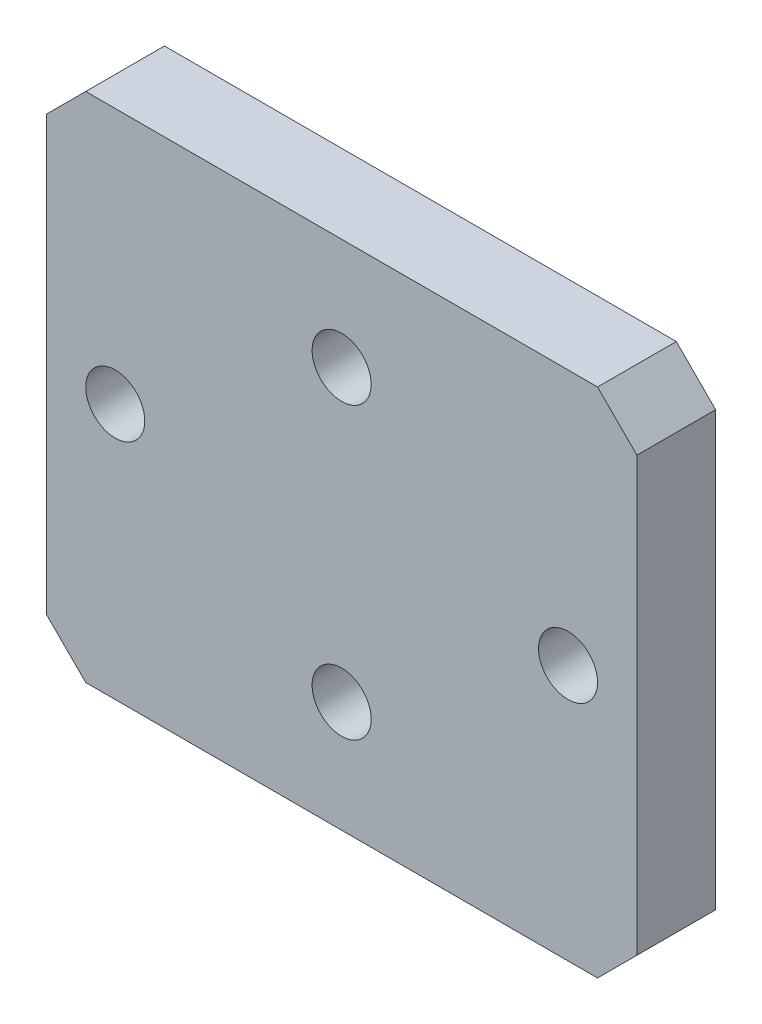
ISO-10303-21;
HEADER;
FILE_DESCRIPTION(('STEP AP214'),'2;1');
FILE_NAME('part.step','',(''),(''),'','','');
FILE_SCHEMA(('AUTOMOTIVE_DESIGN { 1 0 10303 214 1 1 1 1 }'));
ENDSEC;
DATA;
#1=APPLICATION_CONTEXT('core data for automotive mechanical design processes');
#2=APPLICATION_PROTOCOL_DEFINITION('international standard','automotive_design',2000,#1);
#3=PRODUCT_CONTEXT('',#1,'mechanical');
#4=PRODUCT('Part','Part','',(#3));
#5=PRODUCT_RELATED_PRODUCT_CATEGORY('part','',(#4));
#6=PRODUCT_DEFINITION_FORMATION('','',#4);
#7=PRODUCT_DEFINITION_CONTEXT('part definition',#1,'design');
#8=PRODUCT_DEFINITION('design','',#6,#7);
#9=PRODUCT_DEFINITION_SHAPE('','',#8);
#10=(LENGTH_UNIT() NAMED_UNIT(*) SI_UNIT(.MILLI.,.METRE.));
#11=(NAMED_UNIT(*) PLANE_ANGLE_UNIT() SI_UNIT($,.RADIAN.));
#12=(NAMED_UNIT(*) SI_UNIT($,.STERADIAN.) SOLID_ANGLE_UNIT());
#13=UNCERTAINTY_MEASURE_WITH_UNIT(LENGTH_MEASURE(1.E-05),#10,'distance_accuracy_value','');
#14=(GEOMETRIC_REPRESENTATION_CONTEXT(3) GLOBAL_UNCERTAINTY_ASSIGNED_CONTEXT((#13)) GLOBAL_UNIT_ASSIGNED_CONTEXT((#10,
#11,#12)) REPRESENTATION_CONTEXT('',''));
#15=CARTESIAN_POINT('',(0.,0.,0.));
#16=DIRECTION('',(0.,0.,1.));
#17=DIRECTION('',(1.,0.,0.));
#18=AXIS2_PLACEMENT_3D('',#15,#16,#17);
#19=CARTESIAN_POINT('',(0.,0.,4.));
#20=DIRECTION('',(0.,0.,-1.));
#21=DIRECTION('',(-1.,0.,0.));
#22=AXIS2_PLACEMENT_3D('',#19,#20,#21);
#23=PLANE('',#22);
#24=DIRECTION('',(0.,-1.,0.));
#25=VECTOR('',#24,1.);
#26=CARTESIAN_POINT('',(0.,2.,4.));
#27=LINE('',#26,#25);
#28=CARTESIAN_POINT('',(0.,24.,4.));
#29=VERTEX_POINT('',#28);
#30=CARTESIAN_POINT('',(0.,2.,4.));
#31=VERTEX_POINT('',#30);
#32=EDGE_CURVE('E146',#29,#31,#27,.T.);
#33=ORIENTED_EDGE('',*,*,#32,.T.);
#34=DIRECTION('',(0.707106781186548,-0.707106781186548,0.));
#35=VECTOR('',#34,1.);
#36=CARTESIAN_POINT('',(0.,2.,4.));
#37=LINE('',#36,#35);
#38=CARTESIAN_POINT('',(2.,0.,4.));
#39=VERTEX_POINT('',#38);
#40=EDGE_CURVE('E94',#31,#39,#37,.T.);
#41=ORIENTED_EDGE('',*,*,#40,.T.);
#42=DIRECTION('',(1.,0.,0.));
#43=VECTOR('',#42,1.);
#44=CARTESIAN_POINT('',(2.,0.,4.));
#45=LINE('',#44,#43);
#46=CARTESIAN_POINT('',(28.,0.,4.));
#47=VERTEX_POINT('',#46);
#48=EDGE_CURVE('E161',#39,#47,#45,.T.);
#49=ORIENTED_EDGE('',*,*,#48,.T.);
#50=DIRECTION('',(0.707106781186548,0.707106781186547,0.));
#51=VECTOR('',#50,1.);
#52=CARTESIAN_POINT('',(28.,0.,4.));
#53=LINE('',#52,#51);
#54=CARTESIAN_POINT('',(30.,2.,4.));
#55=VERTEX_POINT('',#54);
#56=EDGE_CURVE('E174',#47,#55,#53,.T.);
#57=ORIENTED_EDGE('',*,*,#56,.T.);
#58=DIRECTION('',(0.,1.,0.));
#59=VECTOR('',#58,1.);
#60=CARTESIAN_POINT('',(30.,2.,4.));
#61=LINE('',#60,#59);
#62=CARTESIAN_POINT('',(30.,24.,4.));
#63=VERTEX_POINT('',#62);
#64=EDGE_CURVE('E113',#55,#63,#61,.T.);
#65=ORIENTED_EDGE('',*,*,#64,.T.);
#66=DIRECTION('',(-0.707106781186548,0.707106781186547,0.));
#67=VECTOR('',#66,1.);
#68=CARTESIAN_POINT('',(28.,26.,4.));
#69=LINE('',#68,#67);
#70=CARTESIAN_POINT('',(28.,26.,4.));
#71=VERTEX_POINT('',#70);
#72=EDGE_CURVE('E107',#63,#71,#69,.T.);
#73=ORIENTED_EDGE('',*,*,#72,.T.);
#74=DIRECTION('',(-1.,0.,0.));
#75=VECTOR('',#74,1.);
#76=CARTESIAN_POINT('',(2.,26.,4.));
#77=LINE('',#76,#75);
#78=CARTESIAN_POINT('',(2.,26.,4.));
#79=VERTEX_POINT('',#78);
#80=EDGE_CURVE('E111',#71,#79,#77,.T.);
#81=ORIENTED_EDGE('',*,*,#80,.T.);
#82=DIRECTION('',(-0.707106781186548,-0.707106781186547,0.));
#83=VECTOR('',#82,1.);
#84=CARTESIAN_POINT('',(0.,24.,4.));
#85=LINE('',#84,#83);
#86=EDGE_CURVE('E51',#79,#29,#85,.T.);
#87=ORIENTED_EDGE('',*,*,#86,.T.);
#88=EDGE_LOOP('',(#33,#41,#49,#57,#65,#73,#81,#87));
#89=FACE_BOUND('',#88,.T.);
#90=CARTESIAN_POINT('',(3.5,13.,4.));
#91=DIRECTION('',(0.,0.,1.));
#92=DIRECTION('',(1.,0.,0.));
#93=AXIS2_PLACEMENT_3D('',#90,#91,#92);
#94=CIRCLE('',#93,1.5);
#95=CARTESIAN_POINT('',(5.,13.,4.));
#96=VERTEX_POINT('',#95);
#97=EDGE_CURVE('E135',#96,#96,#94,.T.);
#98=ORIENTED_EDGE('',*,*,#97,.F.);
#99=EDGE_LOOP('',(#98));
#100=FACE_BOUND('',#99,.T.);
#101=CARTESIAN_POINT('',(26.5,13.,4.));
#102=DIRECTION('',(0.,0.,1.));
#103=DIRECTION('',(1.,0.,0.));
#104=AXIS2_PLACEMENT_3D('',#101,#102,#103);
#105=CIRCLE('',#104,1.5);
#106=CARTESIAN_POINT('',(28.,13.,4.));
#107=VERTEX_POINT('',#106);
#108=EDGE_CURVE('E183',#107,#107,#105,.T.);
#109=ORIENTED_EDGE('',*,*,#108,.F.);
#110=EDGE_LOOP('',(#109));
#111=FACE_BOUND('',#110,.T.);
#112=CARTESIAN_POINT('',(15.,20.365,4.));
#113=DIRECTION('',(0.,0.,1.));
#114=DIRECTION('',(1.,0.,0.));
#115=AXIS2_PLACEMENT_3D('',#112,#113,#114);
#116=CIRCLE('',#115,1.5);
#117=CARTESIAN_POINT('',(16.5,20.365,4.));
#118=VERTEX_POINT('',#117);
#119=EDGE_CURVE('E189',#118,#118,#116,.T.);
#120=ORIENTED_EDGE('',*,*,#119,.F.);
#121=EDGE_LOOP('',(#120));
#122=FACE_BOUND('',#121,.T.);
#123=CARTESIAN_POINT('',(15.,5.635,4.));
#124=DIRECTION('',(0.,0.,1.));
#125=DIRECTION('',(1.,0.,0.));
#126=AXIS2_PLACEMENT_3D('',#123,#124,#125);
#127=CIRCLE('',#126,1.5);
#128=CARTESIAN_POINT('',(16.5,5.635,4.));
#129=VERTEX_POINT('',#128);
#130=EDGE_CURVE('E195',#129,#129,#127,.T.);
#131=ORIENTED_EDGE('',*,*,#130,.F.);
#132=EDGE_LOOP('',(#131));
#133=FACE_BOUND('',#132,.T.);
#134=ADVANCED_FACE('F34',(#89,#100,#111,#122,#133),#23,.F.);
#135=CARTESIAN_POINT('',(0.,0.,0.));
#136=DIRECTION('',(0.,0.,-1.));
#137=DIRECTION('',(-1.,0.,0.));
#138=AXIS2_PLACEMENT_3D('',#135,#136,#137);
#139=PLANE('',#138);
#140=CARTESIAN_POINT('',(15.,20.365,0.));
#141=DIRECTION('',(0.,0.,1.));
#142=DIRECTION('',(1.,0.,0.));
#143=AXIS2_PLACEMENT_3D('',#140,#141,#142);
#144=CIRCLE('',#143,1.5);
#145=CARTESIAN_POINT('',(16.5,20.365,0.));
#146=VERTEX_POINT('',#145);
#147=EDGE_CURVE('E192',#146,#146,#144,.T.);
#148=ORIENTED_EDGE('',*,*,#147,.T.);
#149=EDGE_LOOP('',(#148));
#150=FACE_BOUND('',#149,.T.);
#151=CARTESIAN_POINT('',(3.5,13.,0.));
#152=DIRECTION('',(0.,0.,1.));
#153=DIRECTION('',(1.,0.,0.));
#154=AXIS2_PLACEMENT_3D('',#151,#152,#153);
#155=CIRCLE('',#154,1.5);
#156=CARTESIAN_POINT('',(5.,13.,0.));
#157=VERTEX_POINT('',#156);
#158=EDGE_CURVE('E180',#157,#157,#155,.T.);
#159=ORIENTED_EDGE('',*,*,#158,.T.);
#160=EDGE_LOOP('',(#159));
#161=FACE_BOUND('',#160,.T.);
#162=DIRECTION('',(0.,-1.,0.));
#163=VECTOR('',#162,1.);
#164=CARTESIAN_POINT('',(0.,2.,0.));
#165=LINE('',#164,#163);
#166=CARTESIAN_POINT('',(0.,24.,0.));
#167=VERTEX_POINT('',#166);
#168=CARTESIAN_POINT('',(0.,2.,0.));
#169=VERTEX_POINT('',#168);
#170=EDGE_CURVE('E131',#167,#169,#165,.T.);
#171=ORIENTED_EDGE('',*,*,#170,.F.);
#172=DIRECTION('',(-0.707106781186548,-0.707106781186547,0.));
#173=VECTOR('',#172,1.);
#174=CARTESIAN_POINT('',(0.,24.,0.));
#175=LINE('',#174,#173);
#176=CARTESIAN_POINT('',(2.,26.,0.));
#177=VERTEX_POINT('',#176);
#178=EDGE_CURVE('E86',#177,#167,#175,.T.);
#179=ORIENTED_EDGE('',*,*,#178,.F.);
#180=DIRECTION('',(-1.,0.,0.));
#181=VECTOR('',#180,1.);
#182=CARTESIAN_POINT('',(2.,26.,0.));
#183=LINE('',#182,#181);
#184=CARTESIAN_POINT('',(28.,26.,0.));
#185=VERTEX_POINT('',#184);
#186=EDGE_CURVE('E80',#185,#177,#183,.T.);
#187=ORIENTED_EDGE('',*,*,#186,.F.);
#188=DIRECTION('',(-0.707106781186548,0.707106781186547,0.));
#189=VECTOR('',#188,1.);
#190=CARTESIAN_POINT('',(28.,26.,0.));
#191=LINE('',#190,#189);
#192=CARTESIAN_POINT('',(30.,24.,0.));
#193=VERTEX_POINT('',#192);
#194=EDGE_CURVE('E121',#193,#185,#191,.T.);
#195=ORIENTED_EDGE('',*,*,#194,.F.);
#196=DIRECTION('',(0.,1.,0.));
#197=VECTOR('',#196,1.);
#198=CARTESIAN_POINT('',(30.,2.,0.));
#199=LINE('',#198,#197);
#200=CARTESIAN_POINT('',(30.,2.,0.));
#201=VERTEX_POINT('',#200);
#202=EDGE_CURVE('E141',#201,#193,#199,.T.);
#203=ORIENTED_EDGE('',*,*,#202,.F.);
#204=DIRECTION('',(0.707106781186548,0.707106781186547,0.));
#205=VECTOR('',#204,1.);
#206=CARTESIAN_POINT('',(28.,0.,0.));
#207=LINE('',#206,#205);
#208=CARTESIAN_POINT('',(28.,0.,0.));
#209=VERTEX_POINT('',#208);
#210=EDGE_CURVE('E139',#209,#201,#207,.T.);
#211=ORIENTED_EDGE('',*,*,#210,.F.);
#212=DIRECTION('',(1.,0.,0.));
#213=VECTOR('',#212,1.);
#214=CARTESIAN_POINT('',(2.,0.,0.));
#215=LINE('',#214,#213);
#216=CARTESIAN_POINT('',(2.,0.,0.));
#217=VERTEX_POINT('',#216);
#218=EDGE_CURVE('E137',#217,#209,#215,.T.);
#219=ORIENTED_EDGE('',*,*,#218,.F.);
#220=DIRECTION('',(0.707106781186548,-0.707106781186548,0.));
#221=VECTOR('',#220,1.);
#222=CARTESIAN_POINT('',(0.,2.,0.));
#223=LINE('',#222,#221);
#224=EDGE_CURVE('E134',#169,#217,#223,.T.);
#225=ORIENTED_EDGE('',*,*,#224,.F.);
#226=EDGE_LOOP('',(#171,#179,#187,#195,#203,#211,#219,#225));
#227=FACE_BOUND('',#226,.T.);
#228=CARTESIAN_POINT('',(26.5,13.,0.));
#229=DIRECTION('',(0.,0.,1.));
#230=DIRECTION('',(1.,0.,0.));
#231=AXIS2_PLACEMENT_3D('',#228,#229,#230);
#232=CIRCLE('',#231,1.5);
#233=CARTESIAN_POINT('',(28.,13.,0.));
#234=VERTEX_POINT('',#233);
#235=EDGE_CURVE('E186',#234,#234,#232,.T.);
#236=ORIENTED_EDGE('',*,*,#235,.T.);
#237=EDGE_LOOP('',(#236));
#238=FACE_BOUND('',#237,.T.);
#239=CARTESIAN_POINT('',(15.,5.635,0.));
#240=DIRECTION('',(0.,0.,1.));
#241=DIRECTION('',(1.,0.,0.));
#242=AXIS2_PLACEMENT_3D('',#239,#240,#241);
#243=CIRCLE('',#242,1.5);
#244=CARTESIAN_POINT('',(16.5,5.635,0.));
#245=VERTEX_POINT('',#244);
#246=EDGE_CURVE('E198',#245,#245,#243,.T.);
#247=ORIENTED_EDGE('',*,*,#246,.T.);
#248=EDGE_LOOP('',(#247));
#249=FACE_BOUND('',#248,.T.);
#250=ADVANCED_FACE('F165',(#150,#161,#227,#238,#249),#139,.T.);
#251=CARTESIAN_POINT('',(0.,2.,4.));
#252=DIRECTION('',(1.,0.,0.));
#253=DIRECTION('',(0.,0.,-1.));
#254=AXIS2_PLACEMENT_3D('',#251,#252,#253);
#255=PLANE('',#254);
#256=ORIENTED_EDGE('',*,*,#170,.T.);
#257=DIRECTION('',(0.,0.,-1.));
#258=VECTOR('',#257,1.);
#259=CARTESIAN_POINT('',(0.,2.,4.));
#260=LINE('',#259,#258);
#261=EDGE_CURVE('E11',#31,#169,#260,.T.);
#262=ORIENTED_EDGE('',*,*,#261,.F.);
#263=ORIENTED_EDGE('',*,*,#32,.F.);
#264=DIRECTION('',(0.,0.,-1.));
#265=VECTOR('',#264,1.);
#266=CARTESIAN_POINT('',(0.,24.,4.));
#267=LINE('',#266,#265);
#268=EDGE_CURVE('E127',#29,#167,#267,.T.);
#269=ORIENTED_EDGE('',*,*,#268,.T.);
#270=EDGE_LOOP('',(#256,#262,#263,#269));
#271=FACE_BOUND('',#270,.T.);
#272=ADVANCED_FACE('F36',(#271),#255,.F.);
#273=CARTESIAN_POINT('',(0.,2.,4.));
#274=DIRECTION('',(0.707106781186547,0.707106781186547,0.));
#275=DIRECTION('',(-0.707106781186548,0.707106781186548,0.));
#276=AXIS2_PLACEMENT_3D('',#273,#274,#275);
#277=PLANE('',#276);
#278=ORIENTED_EDGE('',*,*,#224,.T.);
#279=DIRECTION('',(0.,0.,-1.));
#280=VECTOR('',#279,1.);
#281=CARTESIAN_POINT('',(2.,0.,4.));
#282=LINE('',#281,#280);
#283=EDGE_CURVE('E43',#39,#217,#282,.T.);
#284=ORIENTED_EDGE('',*,*,#283,.F.);
#285=ORIENTED_EDGE('',*,*,#40,.F.);
#286=ORIENTED_EDGE('',*,*,#261,.T.);
#287=EDGE_LOOP('',(#278,#284,#285,#286));
#288=FACE_BOUND('',#287,.T.);
#289=ADVANCED_FACE('F230',(#288),#277,.F.);
#290=CARTESIAN_POINT('',(2.,0.,4.));
#291=DIRECTION('',(0.,1.,0.));
#292=DIRECTION('',(0.,0.,1.));
#293=AXIS2_PLACEMENT_3D('',#290,#291,#292);
#294=PLANE('',#293);
#295=ORIENTED_EDGE('',*,*,#218,.T.);
#296=DIRECTION('',(0.,0.,-1.));
#297=VECTOR('',#296,1.);
#298=CARTESIAN_POINT('',(28.,0.,4.));
#299=LINE('',#298,#297);
#300=EDGE_CURVE('E153',#47,#209,#299,.T.);
#301=ORIENTED_EDGE('',*,*,#300,.F.);
#302=ORIENTED_EDGE('',*,*,#48,.F.);
#303=ORIENTED_EDGE('',*,*,#283,.T.);
#304=EDGE_LOOP('',(#295,#301,#302,#303));
#305=FACE_BOUND('',#304,.T.);
#306=ADVANCED_FACE('F159',(#305),#294,.F.);
#307=CARTESIAN_POINT('',(28.,0.,4.));
#308=DIRECTION('',(-0.707106781186547,0.707106781186548,0.));
#309=DIRECTION('',(-0.707106781186548,-0.707106781186547,0.));
#310=AXIS2_PLACEMENT_3D('',#307,#308,#309);
#311=PLANE('',#310);
#312=ORIENTED_EDGE('',*,*,#210,.T.);
#313=DIRECTION('',(0.,0.,-1.));
#314=VECTOR('',#313,1.);
#315=CARTESIAN_POINT('',(30.,2.,4.));
#316=LINE('',#315,#314);
#317=EDGE_CURVE('E150',#55,#201,#316,.T.);
#318=ORIENTED_EDGE('',*,*,#317,.F.);
#319=ORIENTED_EDGE('',*,*,#56,.F.);
#320=ORIENTED_EDGE('',*,*,#300,.T.);
#321=EDGE_LOOP('',(#312,#318,#319,#320));
#322=FACE_BOUND('',#321,.T.);
#323=ADVANCED_FACE('F170',(#322),#311,.F.);
#324=CARTESIAN_POINT('',(30.,2.,4.));
#325=DIRECTION('',(-1.,0.,0.));
#326=DIRECTION('',(0.,0.,1.));
#327=AXIS2_PLACEMENT_3D('',#324,#325,#326);
#328=PLANE('',#327);
#329=ORIENTED_EDGE('',*,*,#202,.T.);
#330=DIRECTION('',(0.,0.,-1.));
#331=VECTOR('',#330,1.);
#332=CARTESIAN_POINT('',(30.,24.,4.));
#333=LINE('',#332,#331);
#334=EDGE_CURVE('E122',#63,#193,#333,.T.);
#335=ORIENTED_EDGE('',*,*,#334,.F.);
#336=ORIENTED_EDGE('',*,*,#64,.F.);
#337=ORIENTED_EDGE('',*,*,#317,.T.);
#338=EDGE_LOOP('',(#329,#335,#336,#337));
#339=FACE_BOUND('',#338,.T.);
#340=ADVANCED_FACE('F173',(#339),#328,.F.);
#341=CARTESIAN_POINT('',(28.,26.,4.));
#342=DIRECTION('',(-0.707106781186547,-0.707106781186548,0.));
#343=DIRECTION('',(0.707106781186548,-0.707106781186547,0.));
#344=AXIS2_PLACEMENT_3D('',#341,#342,#343);
#345=PLANE('',#344);
#346=ORIENTED_EDGE('',*,*,#194,.T.);
#347=DIRECTION('',(0.,0.,-1.));
#348=VECTOR('',#347,1.);
#349=CARTESIAN_POINT('',(28.,26.,4.));
#350=LINE('',#349,#348);
#351=EDGE_CURVE('E118',#71,#185,#350,.T.);
#352=ORIENTED_EDGE('',*,*,#351,.F.);
#353=ORIENTED_EDGE('',*,*,#72,.F.);
#354=ORIENTED_EDGE('',*,*,#334,.T.);
#355=EDGE_LOOP('',(#346,#352,#353,#354));
#356=FACE_BOUND('',#355,.T.);
#357=ADVANCED_FACE('F119',(#356),#345,.F.);
#358=CARTESIAN_POINT('',(2.,26.,4.));
#359=DIRECTION('',(0.,-1.,0.));
#360=DIRECTION('',(0.,0.,-1.));
#361=AXIS2_PLACEMENT_3D('',#358,#359,#360);
#362=PLANE('',#361);
#363=ORIENTED_EDGE('',*,*,#186,.T.);
#364=DIRECTION('',(0.,0.,-1.));
#365=VECTOR('',#364,1.);
#366=CARTESIAN_POINT('',(2.,26.,4.));
#367=LINE('',#366,#365);
#368=EDGE_CURVE('E123',#79,#177,#367,.T.);
#369=ORIENTED_EDGE('',*,*,#368,.F.);
#370=ORIENTED_EDGE('',*,*,#80,.F.);
#371=ORIENTED_EDGE('',*,*,#351,.T.);
#372=EDGE_LOOP('',(#363,#369,#370,#371));
#373=FACE_BOUND('',#372,.T.);
#374=ADVANCED_FACE('F125',(#373),#362,.F.);
#375=CARTESIAN_POINT('',(0.,24.,4.));
#376=DIRECTION('',(0.707106781186547,-0.707106781186548,0.));
#377=DIRECTION('',(0.707106781186548,0.707106781186547,0.));
#378=AXIS2_PLACEMENT_3D('',#375,#376,#377);
#379=PLANE('',#378);
#380=ORIENTED_EDGE('',*,*,#178,.T.);
#381=ORIENTED_EDGE('',*,*,#268,.F.);
#382=ORIENTED_EDGE('',*,*,#86,.F.);
#383=ORIENTED_EDGE('',*,*,#368,.T.);
#384=EDGE_LOOP('',(#380,#381,#382,#383));
#385=FACE_BOUND('',#384,.T.);
#386=ADVANCED_FACE('F218',(#385),#379,.F.);
#387=CARTESIAN_POINT('',(3.5,13.,4.));
#388=DIRECTION('',(0.,0.,-1.));
#389=DIRECTION('',(-1.,0.,0.));
#390=AXIS2_PLACEMENT_3D('',#387,#388,#389);
#391=CYLINDRICAL_SURFACE('',#390,1.5);
#392=ORIENTED_EDGE('',*,*,#97,.T.);
#393=EDGE_LOOP('',(#392));
#394=FACE_BOUND('',#393,.T.);
#395=ORIENTED_EDGE('',*,*,#158,.F.);
#396=EDGE_LOOP('',(#395));
#397=FACE_BOUND('',#396,.T.);
#398=ADVANCED_FACE('F215',(#394,#397),#391,.F.);
#399=CARTESIAN_POINT('',(26.5,13.,4.));
#400=DIRECTION('',(0.,0.,-1.));
#401=DIRECTION('',(-1.,0.,0.));
#402=AXIS2_PLACEMENT_3D('',#399,#400,#401);
#403=CYLINDRICAL_SURFACE('',#402,1.5);
#404=ORIENTED_EDGE('',*,*,#108,.T.);
#405=EDGE_LOOP('',(#404));
#406=FACE_BOUND('',#405,.T.);
#407=ORIENTED_EDGE('',*,*,#235,.F.);
#408=EDGE_LOOP('',(#407));
#409=FACE_BOUND('',#408,.T.);
#410=ADVANCED_FACE('F294',(#406,#409),#403,.F.);
#411=CARTESIAN_POINT('',(15.,20.365,4.));
#412=DIRECTION('',(0.,0.,-1.));
#413=DIRECTION('',(-1.,0.,0.));
#414=AXIS2_PLACEMENT_3D('',#411,#412,#413);
#415=CYLINDRICAL_SURFACE('',#414,1.5);
#416=ORIENTED_EDGE('',*,*,#119,.T.);
#417=EDGE_LOOP('',(#416));
#418=FACE_BOUND('',#417,.T.);
#419=ORIENTED_EDGE('',*,*,#147,.F.);
#420=EDGE_LOOP('',(#419));
#421=FACE_BOUND('',#420,.T.);
#422=ADVANCED_FACE('F302',(#418,#421),#415,.F.);
#423=CARTESIAN_POINT('',(15.,5.635,4.));
#424=DIRECTION('',(0.,0.,-1.));
#425=DIRECTION('',(-1.,0.,0.));
#426=AXIS2_PLACEMENT_3D('',#423,#424,#425);
#427=CYLINDRICAL_SURFACE('',#426,1.5);
#428=ORIENTED_EDGE('',*,*,#130,.T.);
#429=EDGE_LOOP('',(#428));
#430=FACE_BOUND('',#429,.T.);
#431=ORIENTED_EDGE('',*,*,#246,.F.);
#432=EDGE_LOOP('',(#431));
#433=FACE_BOUND('',#432,.T.);
#434=ADVANCED_FACE('F204',(#430,#433),#427,.F.);
#435=CLOSED_SHELL('',(#134,#250,#272,#289,#306,#323,#340,#357,#374,#386,#398,#410,#422,#434));
#436=MANIFOLD_SOLID_BREP('B2',#435);
#437=ADVANCED_BREP_SHAPE_REPRESENTATION('',(#18,#436),#14);
#438=SHAPE_DEFINITION_REPRESENTATION(#9,#437);
ENDSEC;
END-ISO-10303-21;
